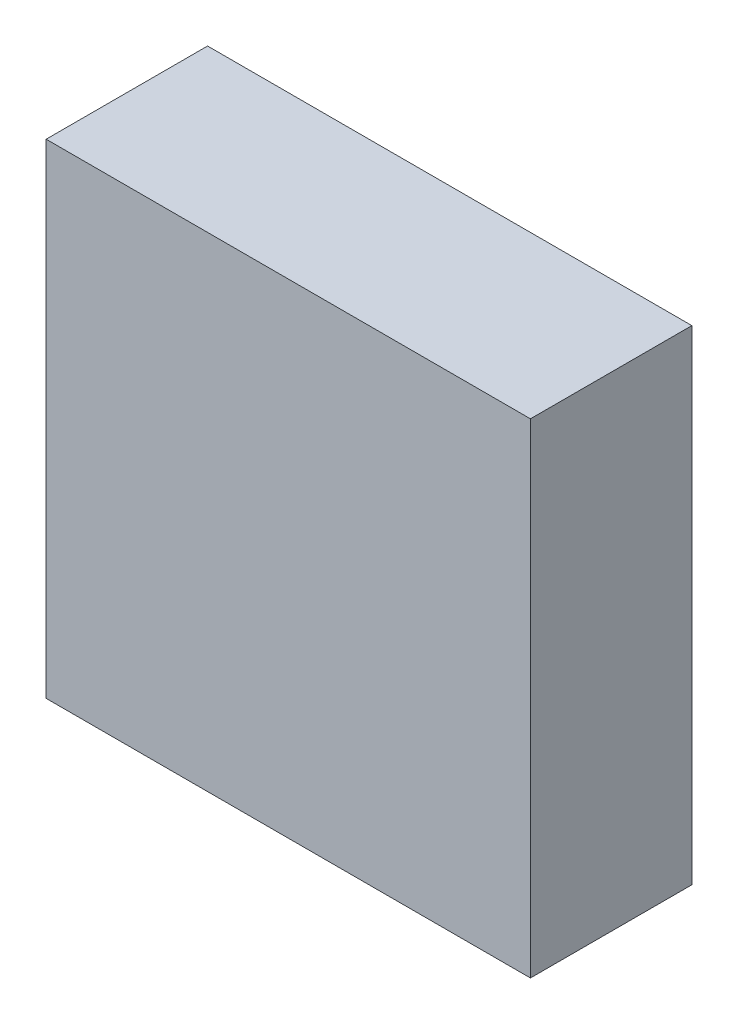
ISO-10303-21;
HEADER;
FILE_DESCRIPTION(('STEP AP214'),'2;1');
FILE_NAME('part.step','',(''),(''),'','','');
FILE_SCHEMA(('AUTOMOTIVE_DESIGN { 1 0 10303 214 1 1 1 1 }'));
ENDSEC;
DATA;
#1=APPLICATION_CONTEXT('core data for automotive mechanical design processes');
#2=APPLICATION_PROTOCOL_DEFINITION('international standard','automotive_design',2000,#1);
#3=PRODUCT_CONTEXT('',#1,'mechanical');
#4=PRODUCT('Part','Part','',(#3));
#5=PRODUCT_RELATED_PRODUCT_CATEGORY('part','',(#4));
#6=PRODUCT_DEFINITION_FORMATION('','',#4);
#7=PRODUCT_DEFINITION_CONTEXT('part definition',#1,'design');
#8=PRODUCT_DEFINITION('design','',#6,#7);
#9=PRODUCT_DEFINITION_SHAPE('','',#8);
#10=(LENGTH_UNIT() NAMED_UNIT(*) SI_UNIT(.MILLI.,.METRE.));
#11=(NAMED_UNIT(*) PLANE_ANGLE_UNIT() SI_UNIT($,.RADIAN.));
#12=(NAMED_UNIT(*) SI_UNIT($,.STERADIAN.) SOLID_ANGLE_UNIT());
#13=UNCERTAINTY_MEASURE_WITH_UNIT(LENGTH_MEASURE(1.E-05),#10,'distance_accuracy_value','');
#14=(GEOMETRIC_REPRESENTATION_CONTEXT(3) GLOBAL_UNCERTAINTY_ASSIGNED_CONTEXT((#13)) GLOBAL_UNIT_ASSIGNED_CONTEXT((#10,
#11,#12)) REPRESENTATION_CONTEXT('',''));
#15=CARTESIAN_POINT('',(0.,0.,0.));
#16=DIRECTION('',(0.,0.,1.));
#17=DIRECTION('',(1.,0.,0.));
#18=AXIS2_PLACEMENT_3D('',#15,#16,#17);
#19=CARTESIAN_POINT('',(-0.440117120742796,-0.566027462482452,1.));
#20=DIRECTION('',(0.,1.,0.));
#21=DIRECTION('',(0.,0.,1.));
#22=AXIS2_PLACEMENT_3D('',#19,#20,#21);
#23=PLANE('',#22);
#24=DIRECTION('',(1.,0.,0.));
#25=VECTOR('',#24,1.);
#26=CARTESIAN_POINT('',(-0.440117120742796,-0.566027462482452,0.));
#27=LINE('',#26,#25);
#28=CARTESIAN_POINT('',(-0.440117120742796,-0.566027462482452,0.));
#29=VERTEX_POINT('',#28);
#30=CARTESIAN_POINT('',(2.5598828792572,-0.566027462482452,0.));
#31=VERTEX_POINT('',#30);
#32=EDGE_CURVE('E96',#29,#31,#27,.T.);
#33=ORIENTED_EDGE('',*,*,#32,.F.);
#34=DIRECTION('',(0.,0.,-1.));
#35=VECTOR('',#34,1.);
#36=CARTESIAN_POINT('',(-0.440117120742796,-0.566027462482452,1.));
#37=LINE('',#36,#35);
#38=CARTESIAN_POINT('',(-0.440117120742796,-0.566027462482452,1.));
#39=VERTEX_POINT('',#38);
#40=EDGE_CURVE('E11',#39,#29,#37,.T.);
#41=ORIENTED_EDGE('',*,*,#40,.F.);
#42=DIRECTION('',(1.,0.,0.));
#43=VECTOR('',#42,1.);
#44=CARTESIAN_POINT('',(-0.440117120742796,-0.566027462482452,1.));
#45=LINE('',#44,#43);
#46=CARTESIAN_POINT('',(2.5598828792572,-0.566027462482452,1.));
#47=VERTEX_POINT('',#46);
#48=EDGE_CURVE('E90',#39,#47,#45,.T.);
#49=ORIENTED_EDGE('',*,*,#48,.T.);
#50=DIRECTION('',(0.,0.,-1.));
#51=VECTOR('',#50,1.);
#52=CARTESIAN_POINT('',(2.5598828792572,-0.566027462482452,1.));
#53=LINE('',#52,#51);
#54=EDGE_CURVE('E35',#47,#31,#53,.T.);
#55=ORIENTED_EDGE('',*,*,#54,.T.);
#56=EDGE_LOOP('',(#33,#41,#49,#55));
#57=FACE_BOUND('',#56,.T.);
#58=ADVANCED_FACE('F32',(#57),#23,.T.);
#59=CARTESIAN_POINT('',(-0.440117120742791,-3.56602746248245,1.));
#60=DIRECTION('',(-1.,0.,0.));
#61=DIRECTION('',(0.,-1.,0.));
#62=AXIS2_PLACEMENT_3D('',#59,#60,#61);
#63=PLANE('',#62);
#64=DIRECTION('',(0.,1.,0.));
#65=VECTOR('',#64,1.);
#66=CARTESIAN_POINT('',(-0.440117120742791,-3.56602746248245,0.));
#67=LINE('',#66,#65);
#68=CARTESIAN_POINT('',(-0.440117120742791,-3.56602746248245,0.));
#69=VERTEX_POINT('',#68);
#70=EDGE_CURVE('E92',#69,#29,#67,.T.);
#71=ORIENTED_EDGE('',*,*,#70,.F.);
#72=DIRECTION('',(0.,0.,-1.));
#73=VECTOR('',#72,1.);
#74=CARTESIAN_POINT('',(-0.440117120742791,-3.56602746248245,1.));
#75=LINE('',#74,#73);
#76=CARTESIAN_POINT('',(-0.440117120742791,-3.56602746248245,1.));
#77=VERTEX_POINT('',#76);
#78=EDGE_CURVE('E41',#77,#69,#75,.T.);
#79=ORIENTED_EDGE('',*,*,#78,.F.);
#80=DIRECTION('',(0.,1.,0.));
#81=VECTOR('',#80,1.);
#82=CARTESIAN_POINT('',(-0.440117120742791,-3.56602746248245,1.));
#83=LINE('',#82,#81);
#84=EDGE_CURVE('E87',#77,#39,#83,.T.);
#85=ORIENTED_EDGE('',*,*,#84,.T.);
#86=ORIENTED_EDGE('',*,*,#40,.T.);
#87=EDGE_LOOP('',(#71,#79,#85,#86));
#88=FACE_BOUND('',#87,.T.);
#89=ADVANCED_FACE('F106',(#88),#63,.T.);
#90=CARTESIAN_POINT('',(2.55988287925721,-3.56602746248245,1.));
#91=DIRECTION('',(0.,-1.,0.));
#92=DIRECTION('',(0.,0.,-1.));
#93=AXIS2_PLACEMENT_3D('',#90,#91,#92);
#94=PLANE('',#93);
#95=DIRECTION('',(-1.,0.,0.));
#96=VECTOR('',#95,1.);
#97=CARTESIAN_POINT('',(2.55988287925721,-3.56602746248245,0.));
#98=LINE('',#97,#96);
#99=CARTESIAN_POINT('',(2.55988287925721,-3.56602746248245,0.));
#100=VERTEX_POINT('',#99);
#101=EDGE_CURVE('E82',#100,#69,#98,.T.);
#102=ORIENTED_EDGE('',*,*,#101,.F.);
#103=DIRECTION('',(0.,0.,-1.));
#104=VECTOR('',#103,1.);
#105=CARTESIAN_POINT('',(2.55988287925721,-3.56602746248245,1.));
#106=LINE('',#105,#104);
#107=CARTESIAN_POINT('',(2.55988287925721,-3.56602746248245,1.));
#108=VERTEX_POINT('',#107);
#109=EDGE_CURVE('E77',#108,#100,#106,.T.);
#110=ORIENTED_EDGE('',*,*,#109,.F.);
#111=DIRECTION('',(-1.,0.,0.));
#112=VECTOR('',#111,1.);
#113=CARTESIAN_POINT('',(2.55988287925721,-3.56602746248245,1.));
#114=LINE('',#113,#112);
#115=EDGE_CURVE('E80',#108,#77,#114,.T.);
#116=ORIENTED_EDGE('',*,*,#115,.T.);
#117=ORIENTED_EDGE('',*,*,#78,.T.);
#118=EDGE_LOOP('',(#102,#110,#116,#117));
#119=FACE_BOUND('',#118,.T.);
#120=ADVANCED_FACE('F79',(#119),#94,.T.);
#121=CARTESIAN_POINT('',(2.5598828792572,-0.566027462482452,1.));
#122=DIRECTION('',(1.,0.,0.));
#123=DIRECTION('',(0.,1.,0.));
#124=AXIS2_PLACEMENT_3D('',#121,#122,#123);
#125=PLANE('',#124);
#126=DIRECTION('',(0.,-1.,0.));
#127=VECTOR('',#126,1.);
#128=CARTESIAN_POINT('',(2.5598828792572,-0.566027462482452,0.));
#129=LINE('',#128,#127);
#130=EDGE_CURVE('E99',#31,#100,#129,.T.);
#131=ORIENTED_EDGE('',*,*,#130,.F.);
#132=ORIENTED_EDGE('',*,*,#54,.F.);
#133=DIRECTION('',(0.,-1.,0.));
#134=VECTOR('',#133,1.);
#135=CARTESIAN_POINT('',(2.5598828792572,-0.566027462482452,1.));
#136=LINE('',#135,#134);
#137=EDGE_CURVE('E86',#47,#108,#136,.T.);
#138=ORIENTED_EDGE('',*,*,#137,.T.);
#139=ORIENTED_EDGE('',*,*,#109,.T.);
#140=EDGE_LOOP('',(#131,#132,#138,#139));
#141=FACE_BOUND('',#140,.T.);
#142=ADVANCED_FACE('F89',(#141),#125,.T.);
#143=CARTESIAN_POINT('',(0.,0.,1.));
#144=DIRECTION('',(0.,0.,-1.));
#145=DIRECTION('',(-1.,0.,0.));
#146=AXIS2_PLACEMENT_3D('',#143,#144,#145);
#147=PLANE('',#146);
#148=ORIENTED_EDGE('',*,*,#48,.F.);
#149=ORIENTED_EDGE('',*,*,#84,.F.);
#150=ORIENTED_EDGE('',*,*,#115,.F.);
#151=ORIENTED_EDGE('',*,*,#137,.F.);
#152=EDGE_LOOP('',(#148,#149,#150,#151));
#153=FACE_BOUND('',#152,.T.);
#154=ADVANCED_FACE('F85',(#153),#147,.F.);
#155=CARTESIAN_POINT('',(0.,0.,0.));
#156=DIRECTION('',(0.,0.,-1.));
#157=DIRECTION('',(-1.,0.,0.));
#158=AXIS2_PLACEMENT_3D('',#155,#156,#157);
#159=PLANE('',#158);
#160=ORIENTED_EDGE('',*,*,#32,.T.);
#161=ORIENTED_EDGE('',*,*,#130,.T.);
#162=ORIENTED_EDGE('',*,*,#101,.T.);
#163=ORIENTED_EDGE('',*,*,#70,.T.);
#164=EDGE_LOOP('',(#160,#161,#162,#163));
#165=FACE_BOUND('',#164,.T.);
#166=ADVANCED_FACE('F105',(#165),#159,.T.);
#167=CLOSED_SHELL('',(#58,#89,#120,#142,#154,#166));
#168=MANIFOLD_SOLID_BREP('B2',#167);
#169=ADVANCED_BREP_SHAPE_REPRESENTATION('',(#18,#168),#14);
#170=SHAPE_DEFINITION_REPRESENTATION(#9,#169);
ENDSEC;
END-ISO-10303-21;
